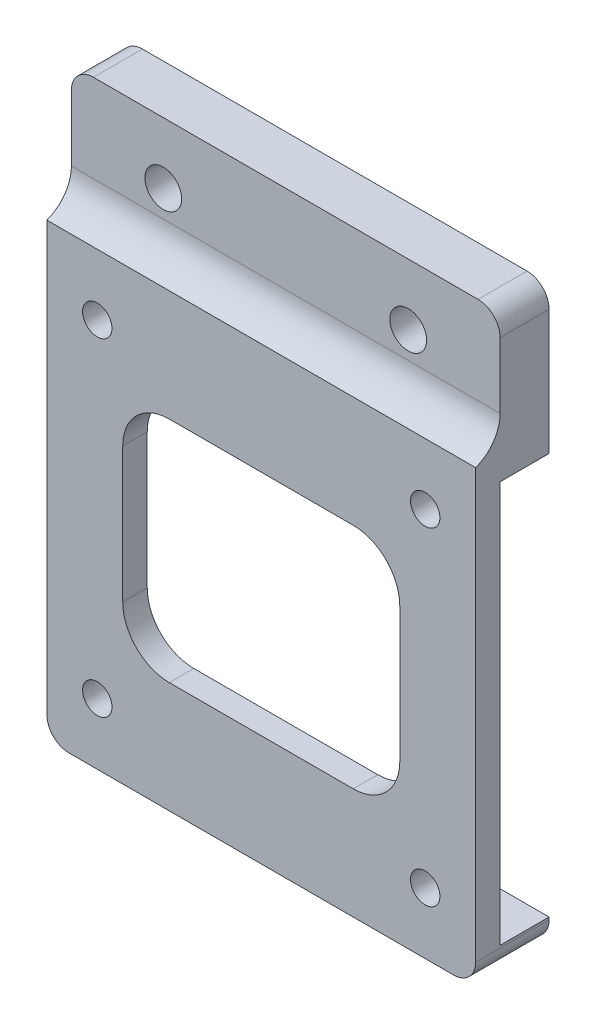
ISO-10303-21;
HEADER;
FILE_DESCRIPTION(('STEP AP214'),'2;1');
FILE_NAME('part.step','',(''),(''),'','','');
FILE_SCHEMA(('AUTOMOTIVE_DESIGN { 1 0 10303 214 1 1 1 1 }'));
ENDSEC;
DATA;
#1=APPLICATION_CONTEXT('core data for automotive mechanical design processes');
#2=APPLICATION_PROTOCOL_DEFINITION('international standard','automotive_design',2000,#1);
#3=PRODUCT_CONTEXT('',#1,'mechanical');
#4=PRODUCT('Part','Part','',(#3));
#5=PRODUCT_RELATED_PRODUCT_CATEGORY('part','',(#4));
#6=PRODUCT_DEFINITION_FORMATION('','',#4);
#7=PRODUCT_DEFINITION_CONTEXT('part definition',#1,'design');
#8=PRODUCT_DEFINITION('design','',#6,#7);
#9=PRODUCT_DEFINITION_SHAPE('','',#8);
#10=(LENGTH_UNIT() NAMED_UNIT(*) SI_UNIT(.MILLI.,.METRE.));
#11=(NAMED_UNIT(*) PLANE_ANGLE_UNIT() SI_UNIT($,.RADIAN.));
#12=(NAMED_UNIT(*) SI_UNIT($,.STERADIAN.) SOLID_ANGLE_UNIT());
#13=UNCERTAINTY_MEASURE_WITH_UNIT(LENGTH_MEASURE(1.E-05),#10,'distance_accuracy_value','');
#14=(GEOMETRIC_REPRESENTATION_CONTEXT(3) GLOBAL_UNCERTAINTY_ASSIGNED_CONTEXT((#13)) GLOBAL_UNIT_ASSIGNED_CONTEXT((#10,
#11,#12)) REPRESENTATION_CONTEXT('',''));
#15=CARTESIAN_POINT('',(0.,0.,0.));
#16=DIRECTION('',(0.,0.,1.));
#17=DIRECTION('',(1.,0.,0.));
#18=AXIS2_PLACEMENT_3D('',#15,#16,#17);
#19=CARTESIAN_POINT('',(0.,0.,0.));
#20=DIRECTION('',(0.,0.,1.));
#21=DIRECTION('',(1.,0.,0.));
#22=AXIS2_PLACEMENT_3D('',#19,#20,#21);
#23=PLANE('',#22);
#24=CARTESIAN_POINT('',(0.,0.,0.));
#25=DIRECTION('',(0.,0.,1.));
#26=DIRECTION('',(1.,0.,0.));
#27=AXIS2_PLACEMENT_3D('',#24,#25,#26);
#28=CIRCLE('',#27,1.905);
#29=CARTESIAN_POINT('',(1.905,0.,0.));
#30=VERTEX_POINT('',#29);
#31=EDGE_CURVE('E280',#30,#30,#28,.T.);
#32=ORIENTED_EDGE('',*,*,#31,.T.);
#33=EDGE_LOOP('',(#32));
#34=FACE_BOUND('',#33,.T.);
#35=CARTESIAN_POINT('',(25.4,0.,0.));
#36=DIRECTION('',(0.,0.,1.));
#37=DIRECTION('',(1.,0.,0.));
#38=AXIS2_PLACEMENT_3D('',#35,#36,#37);
#39=CIRCLE('',#38,1.905);
#40=CARTESIAN_POINT('',(27.305,0.,0.));
#41=VERTEX_POINT('',#40);
#42=EDGE_CURVE('E275',#41,#41,#39,.T.);
#43=ORIENTED_EDGE('',*,*,#42,.T.);
#44=EDGE_LOOP('',(#43));
#45=FACE_BOUND('',#44,.T.);
#46=DIRECTION('',(0.,-1.,0.));
#47=VECTOR('',#46,1.);
#48=CARTESIAN_POINT('',(-9.525,6.35,0.));
#49=LINE('',#48,#47);
#50=CARTESIAN_POINT('',(-9.525,4.064,0.));
#51=VERTEX_POINT('',#50);
#52=CARTESIAN_POINT('',(-9.525,-8.89,0.));
#53=VERTEX_POINT('',#52);
#54=EDGE_CURVE('E304',#51,#53,#49,.T.);
#55=ORIENTED_EDGE('',*,*,#54,.F.);
#56=CARTESIAN_POINT('',(-7.239,4.064,0.));
#57=DIRECTION('',(0.,0.,1.));
#58=DIRECTION('',(1.,0.,0.));
#59=AXIS2_PLACEMENT_3D('',#56,#57,#58);
#60=CIRCLE('',#59,2.286);
#61=CARTESIAN_POINT('',(-7.239,6.35,0.));
#62=VERTEX_POINT('',#61);
#63=EDGE_CURVE('E356',#51,#62,#60,.F.);
#64=ORIENTED_EDGE('',*,*,#63,.T.);
#65=DIRECTION('',(-1.,0.,0.));
#66=VECTOR('',#65,1.);
#67=CARTESIAN_POINT('',(-9.525,6.35,0.));
#68=LINE('',#67,#66);
#69=CARTESIAN_POINT('',(32.639,6.35,0.));
#70=VERTEX_POINT('',#69);
#71=EDGE_CURVE('E296',#70,#62,#68,.T.);
#72=ORIENTED_EDGE('',*,*,#71,.F.);
#73=CARTESIAN_POINT('',(32.639,4.064,0.));
#74=DIRECTION('',(0.,0.,1.));
#75=DIRECTION('',(1.,0.,0.));
#76=AXIS2_PLACEMENT_3D('',#73,#74,#75);
#77=CIRCLE('',#76,2.286);
#78=CARTESIAN_POINT('',(34.925,4.064,0.));
#79=VERTEX_POINT('',#78);
#80=EDGE_CURVE('E353',#70,#79,#77,.F.);
#81=ORIENTED_EDGE('',*,*,#80,.T.);
#82=DIRECTION('',(0.,1.,0.));
#83=VECTOR('',#82,1.);
#84=CARTESIAN_POINT('',(34.925,6.35,0.));
#85=LINE('',#84,#83);
#86=CARTESIAN_POINT('',(34.925,-8.89,0.));
#87=VERTEX_POINT('',#86);
#88=EDGE_CURVE('E311',#87,#79,#85,.T.);
#89=ORIENTED_EDGE('',*,*,#88,.F.);
#90=DIRECTION('',(-1.,0.,0.));
#91=VECTOR('',#90,1.);
#92=CARTESIAN_POINT('',(34.925,-8.89,0.));
#93=LINE('',#92,#91);
#94=EDGE_CURVE('E214',#87,#53,#93,.T.);
#95=ORIENTED_EDGE('',*,*,#94,.T.);
#96=EDGE_LOOP('',(#55,#64,#72,#81,#89,#95));
#97=FACE_BOUND('',#96,.T.);
#98=ADVANCED_FACE('F43',(#34,#45,#97),#23,.F.);
#99=CARTESIAN_POINT('',(-9.525,6.35,5.08));
#100=DIRECTION('',(1.,0.,0.));
#101=DIRECTION('',(0.,1.,0.));
#102=AXIS2_PLACEMENT_3D('',#99,#100,#101);
#103=PLANE('',#102);
#104=CARTESIAN_POINT('',(-9.525,-50.51,0.));
#105=VERTEX_POINT('',#104);
#106=CARTESIAN_POINT('',(-9.52499999999999,-50.764,0.));
#107=VERTEX_POINT('',#106);
#108=EDGE_CURVE('E288',#105,#107,#49,.T.);
#109=ORIENTED_EDGE('',*,*,#108,.T.);
#110=DIRECTION('',(0.,0.,-1.));
#111=VECTOR('',#110,1.);
#112=CARTESIAN_POINT('',(-9.52499999999999,-50.764,5.08));
#113=LINE('',#112,#111);
#114=CARTESIAN_POINT('',(-9.52499999999999,-50.764,7.62));
#115=VERTEX_POINT('',#114);
#116=EDGE_CURVE('E350',#107,#115,#113,.F.);
#117=ORIENTED_EDGE('',*,*,#116,.T.);
#118=DIRECTION('',(0.,-1.,0.));
#119=VECTOR('',#118,1.);
#120=CARTESIAN_POINT('',(-9.52499999999999,-53.05,7.62));
#121=LINE('',#120,#119);
#122=CARTESIAN_POINT('',(-9.52499999999999,-6.35,7.62));
#123=VERTEX_POINT('',#122);
#124=EDGE_CURVE('E259',#123,#115,#121,.T.);
#125=ORIENTED_EDGE('',*,*,#124,.F.);
#126=CARTESIAN_POINT('',(-9.525,-2.75789755157234,8.89));
#127=DIRECTION('',(1.,0.,0.));
#128=DIRECTION('',(0.,1.,0.));
#129=AXIS2_PLACEMENT_3D('',#126,#127,#128);
#130=CIRCLE('',#129,3.81);
#131=CARTESIAN_POINT('',(-9.525,-2.75789755157234,5.08));
#132=VERTEX_POINT('',#131);
#133=EDGE_CURVE('E52',#123,#132,#130,.T.);
#134=ORIENTED_EDGE('',*,*,#133,.T.);
#135=DIRECTION('',(0.,-1.,0.));
#136=VECTOR('',#135,1.);
#137=CARTESIAN_POINT('',(-9.525,6.35,5.08));
#138=LINE('',#137,#136);
#139=CARTESIAN_POINT('',(-9.525,4.064,5.08));
#140=VERTEX_POINT('',#139);
#141=EDGE_CURVE('E292',#140,#132,#138,.T.);
#142=ORIENTED_EDGE('',*,*,#141,.F.);
#143=DIRECTION('',(0.,0.,-1.));
#144=VECTOR('',#143,1.);
#145=CARTESIAN_POINT('',(-9.525,4.064,5.08));
#146=LINE('',#145,#144);
#147=EDGE_CURVE('E346',#140,#51,#146,.T.);
#148=ORIENTED_EDGE('',*,*,#147,.T.);
#149=ORIENTED_EDGE('',*,*,#54,.T.);
#150=DIRECTION('',(0.,0.,-1.));
#151=VECTOR('',#150,1.);
#152=CARTESIAN_POINT('',(-9.525,-8.89,5.08));
#153=LINE('',#152,#151);
#154=CARTESIAN_POINT('',(-9.525,-8.89,5.08));
#155=VERTEX_POINT('',#154);
#156=EDGE_CURVE('E225',#155,#53,#153,.T.);
#157=ORIENTED_EDGE('',*,*,#156,.F.);
#158=DIRECTION('',(0.,-1.,0.));
#159=VECTOR('',#158,1.);
#160=CARTESIAN_POINT('',(-9.525,-8.89,5.08));
#161=LINE('',#160,#159);
#162=CARTESIAN_POINT('',(-9.525,-50.51,5.08));
#163=VERTEX_POINT('',#162);
#164=EDGE_CURVE('E204',#155,#163,#161,.T.);
#165=ORIENTED_EDGE('',*,*,#164,.T.);
#166=DIRECTION('',(0.,0.,-1.));
#167=VECTOR('',#166,1.);
#168=CARTESIAN_POINT('',(-9.525,-50.51,5.08));
#169=LINE('',#168,#167);
#170=EDGE_CURVE('E199',#163,#105,#169,.T.);
#171=ORIENTED_EDGE('',*,*,#170,.T.);
#172=EDGE_LOOP('',(#109,#117,#125,#134,#142,#148,#149,#157,#165,#171));
#173=FACE_BOUND('',#172,.T.);
#174=ADVANCED_FACE('F563',(#173),#103,.F.);
#175=CARTESIAN_POINT('',(34.925,6.35,5.08));
#176=DIRECTION('',(-1.,0.,0.));
#177=DIRECTION('',(0.,-1.,0.));
#178=AXIS2_PLACEMENT_3D('',#175,#176,#177);
#179=PLANE('',#178);
#180=DIRECTION('',(0.,1.,0.));
#181=VECTOR('',#180,1.);
#182=CARTESIAN_POINT('',(34.925,-53.05,7.62));
#183=LINE('',#182,#181);
#184=CARTESIAN_POINT('',(34.925,-50.764,7.62));
#185=VERTEX_POINT('',#184);
#186=CARTESIAN_POINT('',(34.925,-6.35,7.62));
#187=VERTEX_POINT('',#186);
#188=EDGE_CURVE('E267',#185,#187,#183,.T.);
#189=ORIENTED_EDGE('',*,*,#188,.F.);
#190=DIRECTION('',(0.,0.,-1.));
#191=VECTOR('',#190,1.);
#192=CARTESIAN_POINT('',(34.925,-50.764,5.08));
#193=LINE('',#192,#191);
#194=CARTESIAN_POINT('',(34.925,-50.764,0.));
#195=VERTEX_POINT('',#194);
#196=EDGE_CURVE('E324',#185,#195,#193,.T.);
#197=ORIENTED_EDGE('',*,*,#196,.T.);
#198=CARTESIAN_POINT('',(34.925,-50.51,0.));
#199=VERTEX_POINT('',#198);
#200=EDGE_CURVE('E220',#195,#199,#85,.T.);
#201=ORIENTED_EDGE('',*,*,#200,.T.);
#202=DIRECTION('',(0.,0.,-1.));
#203=VECTOR('',#202,1.);
#204=CARTESIAN_POINT('',(34.925,-50.51,5.08));
#205=LINE('',#204,#203);
#206=CARTESIAN_POINT('',(34.925,-50.51,5.08));
#207=VERTEX_POINT('',#206);
#208=EDGE_CURVE('E196',#207,#199,#205,.T.);
#209=ORIENTED_EDGE('',*,*,#208,.F.);
#210=DIRECTION('',(0.,-1.,0.));
#211=VECTOR('',#210,1.);
#212=CARTESIAN_POINT('',(34.925,-8.89,5.08));
#213=LINE('',#212,#211);
#214=CARTESIAN_POINT('',(34.925,-8.89,5.08));
#215=VERTEX_POINT('',#214);
#216=EDGE_CURVE('E205',#215,#207,#213,.T.);
#217=ORIENTED_EDGE('',*,*,#216,.F.);
#218=DIRECTION('',(0.,0.,-1.));
#219=VECTOR('',#218,1.);
#220=CARTESIAN_POINT('',(34.925,-8.89,5.08));
#221=LINE('',#220,#219);
#222=EDGE_CURVE('E320',#215,#87,#221,.T.);
#223=ORIENTED_EDGE('',*,*,#222,.T.);
#224=ORIENTED_EDGE('',*,*,#88,.T.);
#225=DIRECTION('',(0.,0.,-1.));
#226=VECTOR('',#225,1.);
#227=CARTESIAN_POINT('',(34.925,4.064,5.08));
#228=LINE('',#227,#226);
#229=CARTESIAN_POINT('',(34.925,4.064,5.08));
#230=VERTEX_POINT('',#229);
#231=EDGE_CURVE('E303',#79,#230,#228,.F.);
#232=ORIENTED_EDGE('',*,*,#231,.T.);
#233=DIRECTION('',(0.,1.,0.));
#234=VECTOR('',#233,1.);
#235=CARTESIAN_POINT('',(34.925,6.35,5.08));
#236=LINE('',#235,#234);
#237=CARTESIAN_POINT('',(34.925,-2.75789755157234,5.08));
#238=VERTEX_POINT('',#237);
#239=EDGE_CURVE('E295',#238,#230,#236,.T.);
#240=ORIENTED_EDGE('',*,*,#239,.F.);
#241=CARTESIAN_POINT('',(34.925,-2.75789755157234,8.89));
#242=DIRECTION('',(-1.,0.,0.));
#243=DIRECTION('',(0.,-1.,0.));
#244=AXIS2_PLACEMENT_3D('',#241,#242,#243);
#245=CIRCLE('',#244,3.81);
#246=EDGE_CURVE('E11',#238,#187,#245,.T.);
#247=ORIENTED_EDGE('',*,*,#246,.T.);
#248=EDGE_LOOP('',(#189,#197,#201,#209,#217,#223,#224,#232,#240,#247));
#249=FACE_BOUND('',#248,.T.);
#250=ADVANCED_FACE('F217',(#249),#179,.F.);
#251=CARTESIAN_POINT('',(-4.3,-12.7,5.08));
#252=DIRECTION('',(0.,0.,-1.));
#253=DIRECTION('',(-1.,0.,0.));
#254=AXIS2_PLACEMENT_3D('',#251,#252,#253);
#255=CYLINDRICAL_SURFACE('',#254,1.524);
#256=CARTESIAN_POINT('',(-4.3,-12.7,7.62));
#257=DIRECTION('',(0.,0.,1.));
#258=DIRECTION('',(1.,0.,0.));
#259=AXIS2_PLACEMENT_3D('',#256,#257,#258);
#260=CIRCLE('',#259,1.524);
#261=CARTESIAN_POINT('',(-2.776,-12.7,7.62));
#262=VERTEX_POINT('',#261);
#263=EDGE_CURVE('E243',#262,#262,#260,.T.);
#264=ORIENTED_EDGE('',*,*,#263,.T.);
#265=EDGE_LOOP('',(#264));
#266=FACE_BOUND('',#265,.T.);
#267=CARTESIAN_POINT('',(-4.3,-12.7,5.08));
#268=DIRECTION('',(0.,0.,-1.));
#269=DIRECTION('',(-1.,0.,0.));
#270=AXIS2_PLACEMENT_3D('',#267,#268,#269);
#271=CIRCLE('',#270,1.524);
#272=CARTESIAN_POINT('',(-5.824,-12.7,5.08));
#273=VERTEX_POINT('',#272);
#274=EDGE_CURVE('E239',#273,#273,#271,.T.);
#275=ORIENTED_EDGE('',*,*,#274,.T.);
#276=EDGE_LOOP('',(#275));
#277=FACE_BOUND('',#276,.T.);
#278=ADVANCED_FACE('F532',(#266,#277),#255,.F.);
#279=CARTESIAN_POINT('',(29.7,-12.7,5.08));
#280=DIRECTION('',(0.,0.,-1.));
#281=DIRECTION('',(-1.,0.,0.));
#282=AXIS2_PLACEMENT_3D('',#279,#280,#281);
#283=CYLINDRICAL_SURFACE('',#282,1.524);
#284=CARTESIAN_POINT('',(29.7,-12.7,7.62));
#285=DIRECTION('',(0.,0.,1.));
#286=DIRECTION('',(1.,0.,0.));
#287=AXIS2_PLACEMENT_3D('',#284,#285,#286);
#288=CIRCLE('',#287,1.524);
#289=CARTESIAN_POINT('',(31.224,-12.7,7.62));
#290=VERTEX_POINT('',#289);
#291=EDGE_CURVE('E251',#290,#290,#288,.T.);
#292=ORIENTED_EDGE('',*,*,#291,.T.);
#293=EDGE_LOOP('',(#292));
#294=FACE_BOUND('',#293,.T.);
#295=CARTESIAN_POINT('',(29.7,-12.7,5.08));
#296=DIRECTION('',(0.,0.,-1.));
#297=DIRECTION('',(-1.,0.,0.));
#298=AXIS2_PLACEMENT_3D('',#295,#296,#297);
#299=CIRCLE('',#298,1.524);
#300=CARTESIAN_POINT('',(28.176,-12.7,5.08));
#301=VERTEX_POINT('',#300);
#302=EDGE_CURVE('E234',#301,#301,#299,.T.);
#303=ORIENTED_EDGE('',*,*,#302,.T.);
#304=EDGE_LOOP('',(#303));
#305=FACE_BOUND('',#304,.T.);
#306=ADVANCED_FACE('F535',(#294,#305),#283,.F.);
#307=CARTESIAN_POINT('',(29.7,-46.7,5.08));
#308=DIRECTION('',(0.,0.,-1.));
#309=DIRECTION('',(-1.,0.,0.));
#310=AXIS2_PLACEMENT_3D('',#307,#308,#309);
#311=CYLINDRICAL_SURFACE('',#310,1.524);
#312=CARTESIAN_POINT('',(29.7,-46.7,7.62));
#313=DIRECTION('',(0.,0.,1.));
#314=DIRECTION('',(1.,0.,0.));
#315=AXIS2_PLACEMENT_3D('',#312,#313,#314);
#316=CIRCLE('',#315,1.524);
#317=CARTESIAN_POINT('',(31.224,-46.7,7.62));
#318=VERTEX_POINT('',#317);
#319=EDGE_CURVE('E247',#318,#318,#316,.T.);
#320=ORIENTED_EDGE('',*,*,#319,.T.);
#321=EDGE_LOOP('',(#320));
#322=FACE_BOUND('',#321,.T.);
#323=CARTESIAN_POINT('',(29.7,-46.7,5.08));
#324=DIRECTION('',(0.,0.,-1.));
#325=DIRECTION('',(-1.,0.,0.));
#326=AXIS2_PLACEMENT_3D('',#323,#324,#325);
#327=CIRCLE('',#326,1.524);
#328=CARTESIAN_POINT('',(28.176,-46.7,5.08));
#329=VERTEX_POINT('',#328);
#330=EDGE_CURVE('E230',#329,#329,#327,.T.);
#331=ORIENTED_EDGE('',*,*,#330,.T.);
#332=EDGE_LOOP('',(#331));
#333=FACE_BOUND('',#332,.T.);
#334=ADVANCED_FACE('F551',(#322,#333),#311,.F.);
#335=CARTESIAN_POINT('',(-4.3,-46.7,5.08));
#336=DIRECTION('',(0.,0.,-1.));
#337=DIRECTION('',(-1.,0.,0.));
#338=AXIS2_PLACEMENT_3D('',#335,#336,#337);
#339=CYLINDRICAL_SURFACE('',#338,1.524);
#340=CARTESIAN_POINT('',(-4.3,-46.7,7.62));
#341=DIRECTION('',(0.,0.,1.));
#342=DIRECTION('',(1.,0.,0.));
#343=AXIS2_PLACEMENT_3D('',#340,#341,#342);
#344=CIRCLE('',#343,1.524);
#345=CARTESIAN_POINT('',(-2.776,-46.7,7.62));
#346=VERTEX_POINT('',#345);
#347=EDGE_CURVE('E255',#346,#346,#344,.T.);
#348=ORIENTED_EDGE('',*,*,#347,.T.);
#349=EDGE_LOOP('',(#348));
#350=FACE_BOUND('',#349,.T.);
#351=CARTESIAN_POINT('',(-4.3,-46.7,5.08));
#352=DIRECTION('',(0.,0.,-1.));
#353=DIRECTION('',(-1.,0.,0.));
#354=AXIS2_PLACEMENT_3D('',#351,#352,#353);
#355=CIRCLE('',#354,1.524);
#356=CARTESIAN_POINT('',(-5.824,-46.7,5.08));
#357=VERTEX_POINT('',#356);
#358=EDGE_CURVE('E235',#357,#357,#355,.T.);
#359=ORIENTED_EDGE('',*,*,#358,.T.);
#360=EDGE_LOOP('',(#359));
#361=FACE_BOUND('',#360,.T.);
#362=ADVANCED_FACE('F548',(#350,#361),#339,.F.);
#363=CARTESIAN_POINT('',(0.,0.,5.08));
#364=DIRECTION('',(0.,0.,1.));
#365=DIRECTION('',(1.,0.,0.));
#366=AXIS2_PLACEMENT_3D('',#363,#364,#365);
#367=PLANE('',#366);
#368=ORIENTED_EDGE('',*,*,#141,.T.);
#369=DIRECTION('',(-1.,0.,0.));
#370=VECTOR('',#369,1.);
#371=CARTESIAN_POINT('',(34.925,-2.75789755157234,5.08));
#372=LINE('',#371,#370);
#373=EDGE_CURVE('E59',#132,#238,#372,.F.);
#374=ORIENTED_EDGE('',*,*,#373,.T.);
#375=ORIENTED_EDGE('',*,*,#239,.T.);
#376=CARTESIAN_POINT('',(32.639,4.064,5.08));
#377=DIRECTION('',(0.,0.,1.));
#378=DIRECTION('',(1.,0.,0.));
#379=AXIS2_PLACEMENT_3D('',#376,#377,#378);
#380=CIRCLE('',#379,2.286);
#381=CARTESIAN_POINT('',(32.639,6.35,5.08));
#382=VERTEX_POINT('',#381);
#383=EDGE_CURVE('E366',#230,#382,#380,.T.);
#384=ORIENTED_EDGE('',*,*,#383,.T.);
#385=DIRECTION('',(-1.,0.,0.));
#386=VECTOR('',#385,1.);
#387=CARTESIAN_POINT('',(-9.525,6.35,5.08));
#388=LINE('',#387,#386);
#389=CARTESIAN_POINT('',(-7.239,6.35,5.08));
#390=VERTEX_POINT('',#389);
#391=EDGE_CURVE('E299',#382,#390,#388,.T.);
#392=ORIENTED_EDGE('',*,*,#391,.T.);
#393=CARTESIAN_POINT('',(-7.239,4.064,5.08));
#394=DIRECTION('',(0.,0.,1.));
#395=DIRECTION('',(1.,0.,0.));
#396=AXIS2_PLACEMENT_3D('',#393,#394,#395);
#397=CIRCLE('',#396,2.286);
#398=EDGE_CURVE('E369',#390,#140,#397,.T.);
#399=ORIENTED_EDGE('',*,*,#398,.T.);
#400=EDGE_LOOP('',(#368,#374,#375,#384,#392,#399));
#401=FACE_BOUND('',#400,.T.);
#402=CARTESIAN_POINT('',(0.,0.,5.08));
#403=DIRECTION('',(0.,0.,1.));
#404=DIRECTION('',(1.,0.,0.));
#405=AXIS2_PLACEMENT_3D('',#402,#403,#404);
#406=CIRCLE('',#405,1.905);
#407=CARTESIAN_POINT('',(1.905,0.,5.08));
#408=VERTEX_POINT('',#407);
#409=EDGE_CURVE('E284',#408,#408,#406,.T.);
#410=ORIENTED_EDGE('',*,*,#409,.F.);
#411=EDGE_LOOP('',(#410));
#412=FACE_BOUND('',#411,.T.);
#413=CARTESIAN_POINT('',(25.4,0.,5.08));
#414=DIRECTION('',(0.,0.,1.));
#415=DIRECTION('',(1.,0.,0.));
#416=AXIS2_PLACEMENT_3D('',#413,#414,#415);
#417=CIRCLE('',#416,1.905);
#418=CARTESIAN_POINT('',(27.305,0.,5.08));
#419=VERTEX_POINT('',#418);
#420=EDGE_CURVE('E276',#419,#419,#417,.T.);
#421=ORIENTED_EDGE('',*,*,#420,.F.);
#422=EDGE_LOOP('',(#421));
#423=FACE_BOUND('',#422,.T.);
#424=ADVANCED_FACE('F550',(#401,#412,#423),#367,.T.);
#425=ORIENTED_EDGE('',*,*,#200,.F.);
#426=CARTESIAN_POINT('',(32.639,-50.764,0.));
#427=DIRECTION('',(0.,0.,1.));
#428=DIRECTION('',(1.,0.,0.));
#429=AXIS2_PLACEMENT_3D('',#426,#427,#428);
#430=CIRCLE('',#429,2.286);
#431=CARTESIAN_POINT('',(32.639,-53.05,0.));
#432=VERTEX_POINT('',#431);
#433=EDGE_CURVE('E330',#195,#432,#430,.F.);
#434=ORIENTED_EDGE('',*,*,#433,.T.);
#435=DIRECTION('',(1.,0.,0.));
#436=VECTOR('',#435,1.);
#437=CARTESIAN_POINT('',(-9.52499999999999,-53.05,0.));
#438=LINE('',#437,#436);
#439=CARTESIAN_POINT('',(-7.23899999999999,-53.05,0.));
#440=VERTEX_POINT('',#439);
#441=EDGE_CURVE('E307',#440,#432,#438,.T.);
#442=ORIENTED_EDGE('',*,*,#441,.F.);
#443=CARTESIAN_POINT('',(-7.23899999999999,-50.764,0.));
#444=DIRECTION('',(0.,0.,1.));
#445=DIRECTION('',(1.,0.,0.));
#446=AXIS2_PLACEMENT_3D('',#443,#444,#445);
#447=CIRCLE('',#446,2.286);
#448=EDGE_CURVE('E327',#440,#107,#447,.F.);
#449=ORIENTED_EDGE('',*,*,#448,.T.);
#450=ORIENTED_EDGE('',*,*,#108,.F.);
#451=DIRECTION('',(-1.,0.,0.));
#452=VECTOR('',#451,1.);
#453=CARTESIAN_POINT('',(34.925,-50.51,0.));
#454=LINE('',#453,#452);
#455=EDGE_CURVE('E456',#199,#105,#454,.T.);
#456=ORIENTED_EDGE('',*,*,#455,.F.);
#457=EDGE_LOOP('',(#425,#434,#442,#449,#450,#456));
#458=FACE_BOUND('',#457,.T.);
#459=ADVANCED_FACE('F558',(#458),#23,.F.);
#460=CARTESIAN_POINT('',(-9.52499999999999,-53.05,5.08));
#461=DIRECTION('',(0.,1.,0.));
#462=DIRECTION('',(0.,0.,1.));
#463=AXIS2_PLACEMENT_3D('',#460,#461,#462);
#464=PLANE('',#463);
#465=ORIENTED_EDGE('',*,*,#441,.T.);
#466=DIRECTION('',(0.,0.,-1.));
#467=VECTOR('',#466,1.);
#468=CARTESIAN_POINT('',(32.639,-53.05,5.08));
#469=LINE('',#468,#467);
#470=CARTESIAN_POINT('',(32.639,-53.05,7.62));
#471=VERTEX_POINT('',#470);
#472=EDGE_CURVE('E337',#432,#471,#469,.F.);
#473=ORIENTED_EDGE('',*,*,#472,.T.);
#474=DIRECTION('',(1.,0.,0.));
#475=VECTOR('',#474,1.);
#476=CARTESIAN_POINT('',(-9.52499999999999,-53.05,7.62));
#477=LINE('',#476,#475);
#478=CARTESIAN_POINT('',(-7.23899999999999,-53.05,7.62));
#479=VERTEX_POINT('',#478);
#480=EDGE_CURVE('E263',#479,#471,#477,.T.);
#481=ORIENTED_EDGE('',*,*,#480,.F.);
#482=DIRECTION('',(0.,0.,-1.));
#483=VECTOR('',#482,1.);
#484=CARTESIAN_POINT('',(-7.23899999999999,-53.05,5.08));
#485=LINE('',#484,#483);
#486=EDGE_CURVE('E333',#479,#440,#485,.T.);
#487=ORIENTED_EDGE('',*,*,#486,.T.);
#488=EDGE_LOOP('',(#465,#473,#481,#487));
#489=FACE_BOUND('',#488,.T.);
#490=ADVANCED_FACE('F573',(#489),#464,.F.);
#491=CARTESIAN_POINT('',(-9.525,6.35,5.08));
#492=DIRECTION('',(0.,-1.,0.));
#493=DIRECTION('',(0.,0.,-1.));
#494=AXIS2_PLACEMENT_3D('',#491,#492,#493);
#495=PLANE('',#494);
#496=ORIENTED_EDGE('',*,*,#71,.T.);
#497=DIRECTION('',(0.,0.,-1.));
#498=VECTOR('',#497,1.);
#499=CARTESIAN_POINT('',(-7.239,6.35,5.08));
#500=LINE('',#499,#498);
#501=EDGE_CURVE('E363',#62,#390,#500,.F.);
#502=ORIENTED_EDGE('',*,*,#501,.T.);
#503=ORIENTED_EDGE('',*,*,#391,.F.);
#504=DIRECTION('',(0.,0.,-1.));
#505=VECTOR('',#504,1.);
#506=CARTESIAN_POINT('',(32.639,6.35,5.08));
#507=LINE('',#506,#505);
#508=EDGE_CURVE('E359',#382,#70,#507,.T.);
#509=ORIENTED_EDGE('',*,*,#508,.T.);
#510=EDGE_LOOP('',(#496,#502,#503,#509));
#511=FACE_BOUND('',#510,.T.);
#512=ADVANCED_FACE('F578',(#511),#495,.F.);
#513=CARTESIAN_POINT('',(0.,0.,5.08));
#514=DIRECTION('',(0.,0.,-1.));
#515=DIRECTION('',(-1.,0.,0.));
#516=AXIS2_PLACEMENT_3D('',#513,#514,#515);
#517=CYLINDRICAL_SURFACE('',#516,1.905);
#518=ORIENTED_EDGE('',*,*,#409,.T.);
#519=EDGE_LOOP('',(#518));
#520=FACE_BOUND('',#519,.T.);
#521=ORIENTED_EDGE('',*,*,#31,.F.);
#522=EDGE_LOOP('',(#521));
#523=FACE_BOUND('',#522,.T.);
#524=ADVANCED_FACE('F775',(#520,#523),#517,.F.);
#525=CARTESIAN_POINT('',(25.4,0.,5.08));
#526=DIRECTION('',(0.,0.,-1.));
#527=DIRECTION('',(-1.,0.,0.));
#528=AXIS2_PLACEMENT_3D('',#525,#526,#527);
#529=CYLINDRICAL_SURFACE('',#528,1.905);
#530=ORIENTED_EDGE('',*,*,#420,.T.);
#531=EDGE_LOOP('',(#530));
#532=FACE_BOUND('',#531,.T.);
#533=ORIENTED_EDGE('',*,*,#42,.F.);
#534=EDGE_LOOP('',(#533));
#535=FACE_BOUND('',#534,.T.);
#536=ADVANCED_FACE('F519',(#532,#535),#529,.F.);
#537=CARTESIAN_POINT('',(0.,0.,7.62));
#538=DIRECTION('',(0.,0.,-1.));
#539=DIRECTION('',(-1.,0.,0.));
#540=AXIS2_PLACEMENT_3D('',#537,#538,#539);
#541=PLANE('',#540);
#542=DIRECTION('',(1.,0.,0.));
#543=VECTOR('',#542,1.);
#544=CARTESIAN_POINT('',(-1.66203160509487,-41.5319327731093,7.62));
#545=LINE('',#544,#543);
#546=CARTESIAN_POINT('',(3.16396839490513,-41.5319327731093,7.62));
#547=VERTEX_POINT('',#546);
#548=CARTESIAN_POINT('',(22.2360316050949,-41.5319327731093,7.62));
#549=VERTEX_POINT('',#548);
#550=EDGE_CURVE('E469',#547,#549,#545,.T.);
#551=ORIENTED_EDGE('',*,*,#550,.F.);
#552=CARTESIAN_POINT('',(3.16396839490513,-36.7059327731093,7.62));
#553=DIRECTION('',(0.,0.,-1.));
#554=DIRECTION('',(-1.,0.,0.));
#555=AXIS2_PLACEMENT_3D('',#552,#553,#554);
#556=CIRCLE('',#555,4.826);
#557=CARTESIAN_POINT('',(-1.66203160509487,-36.7059327731093,7.62));
#558=VERTEX_POINT('',#557);
#559=EDGE_CURVE('E422',#547,#558,#556,.T.);
#560=ORIENTED_EDGE('',*,*,#559,.T.);
#561=DIRECTION('',(0.,-1.,0.));
#562=VECTOR('',#561,1.);
#563=CARTESIAN_POINT('',(-1.66203160509487,-17.8680672268908,7.62));
#564=LINE('',#563,#562);
#565=CARTESIAN_POINT('',(-1.66203160509487,-22.6940672268908,7.62));
#566=VERTEX_POINT('',#565);
#567=EDGE_CURVE('E473',#566,#558,#564,.T.);
#568=ORIENTED_EDGE('',*,*,#567,.F.);
#569=CARTESIAN_POINT('',(3.16396839490513,-22.6940672268908,7.62));
#570=DIRECTION('',(0.,0.,-1.));
#571=DIRECTION('',(-1.,0.,0.));
#572=AXIS2_PLACEMENT_3D('',#569,#570,#571);
#573=CIRCLE('',#572,4.826);
#574=CARTESIAN_POINT('',(3.16396839490513,-17.8680672268908,7.62));
#575=VERTEX_POINT('',#574);
#576=EDGE_CURVE('E434',#566,#575,#573,.T.);
#577=ORIENTED_EDGE('',*,*,#576,.T.);
#578=DIRECTION('',(1.,0.,0.));
#579=VECTOR('',#578,1.);
#580=CARTESIAN_POINT('',(-1.66203160509487,-17.8680672268908,7.62));
#581=LINE('',#580,#579);
#582=CARTESIAN_POINT('',(22.2360316050949,-17.8680672268908,7.62));
#583=VERTEX_POINT('',#582);
#584=EDGE_CURVE('E458',#575,#583,#581,.T.);
#585=ORIENTED_EDGE('',*,*,#584,.T.);
#586=CARTESIAN_POINT('',(22.2360316050949,-22.6940672268908,7.62));
#587=DIRECTION('',(0.,0.,-1.));
#588=DIRECTION('',(-1.,0.,0.));
#589=AXIS2_PLACEMENT_3D('',#586,#587,#588);
#590=CIRCLE('',#589,4.826);
#591=CARTESIAN_POINT('',(27.0620316050949,-22.6940672268908,7.62));
#592=VERTEX_POINT('',#591);
#593=EDGE_CURVE('E428',#583,#592,#590,.T.);
#594=ORIENTED_EDGE('',*,*,#593,.T.);
#595=DIRECTION('',(0.,-1.,0.));
#596=VECTOR('',#595,1.);
#597=CARTESIAN_POINT('',(27.0620316050949,-17.8680672268908,7.62));
#598=LINE('',#597,#596);
#599=CARTESIAN_POINT('',(27.0620316050949,-36.7059327731093,7.62));
#600=VERTEX_POINT('',#599);
#601=EDGE_CURVE('E465',#592,#600,#598,.T.);
#602=ORIENTED_EDGE('',*,*,#601,.T.);
#603=CARTESIAN_POINT('',(22.2360316050949,-36.7059327731093,7.62));
#604=DIRECTION('',(0.,0.,-1.));
#605=DIRECTION('',(-1.,0.,0.));
#606=AXIS2_PLACEMENT_3D('',#603,#604,#605);
#607=CIRCLE('',#606,4.826);
#608=EDGE_CURVE('E416',#600,#549,#607,.T.);
#609=ORIENTED_EDGE('',*,*,#608,.T.);
#610=EDGE_LOOP('',(#551,#560,#568,#577,#585,#594,#602,#609));
#611=FACE_BOUND('',#610,.T.);
#612=ORIENTED_EDGE('',*,*,#480,.T.);
#613=CARTESIAN_POINT('',(32.639,-50.764,7.62));
#614=DIRECTION('',(0.,0.,-1.));
#615=DIRECTION('',(-1.,0.,0.));
#616=AXIS2_PLACEMENT_3D('',#613,#614,#615);
#617=CIRCLE('',#616,2.286);
#618=EDGE_CURVE('E343',#471,#185,#617,.F.);
#619=ORIENTED_EDGE('',*,*,#618,.T.);
#620=ORIENTED_EDGE('',*,*,#188,.T.);
#621=DIRECTION('',(-1.,0.,0.));
#622=VECTOR('',#621,1.);
#623=CARTESIAN_POINT('',(-9.52499999999999,-6.35,7.62));
#624=LINE('',#623,#622);
#625=EDGE_CURVE('E271',#187,#123,#624,.T.);
#626=ORIENTED_EDGE('',*,*,#625,.T.);
#627=ORIENTED_EDGE('',*,*,#124,.T.);
#628=CARTESIAN_POINT('',(-7.23899999999999,-50.764,7.62));
#629=DIRECTION('',(0.,0.,-1.));
#630=DIRECTION('',(-1.,0.,0.));
#631=AXIS2_PLACEMENT_3D('',#628,#629,#630);
#632=CIRCLE('',#631,2.286);
#633=EDGE_CURVE('E340',#115,#479,#632,.F.);
#634=ORIENTED_EDGE('',*,*,#633,.T.);
#635=EDGE_LOOP('',(#612,#619,#620,#626,#627,#634));
#636=FACE_BOUND('',#635,.T.);
#637=ORIENTED_EDGE('',*,*,#347,.F.);
#638=EDGE_LOOP('',(#637));
#639=FACE_BOUND('',#638,.T.);
#640=ORIENTED_EDGE('',*,*,#291,.F.);
#641=EDGE_LOOP('',(#640));
#642=FACE_BOUND('',#641,.T.);
#643=ORIENTED_EDGE('',*,*,#319,.F.);
#644=EDGE_LOOP('',(#643));
#645=FACE_BOUND('',#644,.T.);
#646=ORIENTED_EDGE('',*,*,#263,.F.);
#647=EDGE_LOOP('',(#646));
#648=FACE_BOUND('',#647,.T.);
#649=ADVANCED_FACE('F515',(#611,#636,#639,#642,#645,#648),#541,.F.);
#650=CARTESIAN_POINT('',(34.925,-8.89,5.08));
#651=DIRECTION('',(0.,-1.,0.));
#652=DIRECTION('',(1.,0.,0.));
#653=AXIS2_PLACEMENT_3D('',#650,#651,#652);
#654=PLANE('',#653);
#655=ORIENTED_EDGE('',*,*,#94,.F.);
#656=ORIENTED_EDGE('',*,*,#222,.F.);
#657=DIRECTION('',(-1.,0.,0.));
#658=VECTOR('',#657,1.);
#659=CARTESIAN_POINT('',(34.925,-8.89,5.08));
#660=LINE('',#659,#658);
#661=EDGE_CURVE('E209',#215,#155,#660,.T.);
#662=ORIENTED_EDGE('',*,*,#661,.T.);
#663=ORIENTED_EDGE('',*,*,#156,.T.);
#664=EDGE_LOOP('',(#655,#656,#662,#663));
#665=FACE_BOUND('',#664,.T.);
#666=ADVANCED_FACE('F518',(#665),#654,.T.);
#667=CARTESIAN_POINT('',(34.925,-50.51,5.08));
#668=DIRECTION('',(0.,-1.,0.));
#669=DIRECTION('',(0.,0.,-1.));
#670=AXIS2_PLACEMENT_3D('',#667,#668,#669);
#671=PLANE('',#670);
#672=ORIENTED_EDGE('',*,*,#455,.T.);
#673=ORIENTED_EDGE('',*,*,#170,.F.);
#674=DIRECTION('',(-1.,0.,0.));
#675=VECTOR('',#674,1.);
#676=CARTESIAN_POINT('',(34.925,-50.51,5.08));
#677=LINE('',#676,#675);
#678=EDGE_CURVE('E192',#207,#163,#677,.T.);
#679=ORIENTED_EDGE('',*,*,#678,.F.);
#680=ORIENTED_EDGE('',*,*,#208,.T.);
#681=EDGE_LOOP('',(#672,#673,#679,#680));
#682=FACE_BOUND('',#681,.T.);
#683=ADVANCED_FACE('F194',(#682),#671,.F.);
#684=CARTESIAN_POINT('',(0.,0.,5.08));
#685=DIRECTION('',(0.,0.,-1.));
#686=DIRECTION('',(-1.,0.,0.));
#687=AXIS2_PLACEMENT_3D('',#684,#685,#686);
#688=PLANE('',#687);
#689=DIRECTION('',(0.,1.,0.));
#690=VECTOR('',#689,1.);
#691=CARTESIAN_POINT('',(-1.66203160509487,0.,5.08));
#692=LINE('',#691,#690);
#693=CARTESIAN_POINT('',(-1.66203160509487,-36.7059327731093,5.08));
#694=VERTEX_POINT('',#693);
#695=CARTESIAN_POINT('',(-1.66203160509487,-22.6940672268908,5.08));
#696=VERTEX_POINT('',#695);
#697=EDGE_CURVE('E384',#694,#696,#692,.T.);
#698=ORIENTED_EDGE('',*,*,#697,.F.);
#699=CARTESIAN_POINT('',(3.16396839490513,-36.7059327731093,5.08));
#700=DIRECTION('',(0.,0.,-1.));
#701=DIRECTION('',(-1.,0.,0.));
#702=AXIS2_PLACEMENT_3D('',#699,#700,#701);
#703=CIRCLE('',#702,4.826);
#704=CARTESIAN_POINT('',(3.16396839490513,-41.5319327731093,5.08));
#705=VERTEX_POINT('',#704);
#706=EDGE_CURVE('E425',#694,#705,#703,.F.);
#707=ORIENTED_EDGE('',*,*,#706,.T.);
#708=DIRECTION('',(-1.,0.,0.));
#709=VECTOR('',#708,1.);
#710=CARTESIAN_POINT('',(0.,-41.5319327731093,5.08));
#711=LINE('',#710,#709);
#712=CARTESIAN_POINT('',(22.2360316050949,-41.5319327731093,5.08));
#713=VERTEX_POINT('',#712);
#714=EDGE_CURVE('E372',#713,#705,#711,.T.);
#715=ORIENTED_EDGE('',*,*,#714,.F.);
#716=CARTESIAN_POINT('',(22.2360316050949,-36.7059327731093,5.08));
#717=DIRECTION('',(0.,0.,-1.));
#718=DIRECTION('',(-1.,0.,0.));
#719=AXIS2_PLACEMENT_3D('',#716,#717,#718);
#720=CIRCLE('',#719,4.826);
#721=CARTESIAN_POINT('',(27.0620316050949,-36.7059327731093,5.08));
#722=VERTEX_POINT('',#721);
#723=EDGE_CURVE('E419',#713,#722,#720,.F.);
#724=ORIENTED_EDGE('',*,*,#723,.T.);
#725=DIRECTION('',(0.,1.,0.));
#726=VECTOR('',#725,1.);
#727=CARTESIAN_POINT('',(27.0620316050949,0.,5.08));
#728=LINE('',#727,#726);
#729=CARTESIAN_POINT('',(27.0620316050949,-22.6940672268908,5.08));
#730=VERTEX_POINT('',#729);
#731=EDGE_CURVE('E376',#722,#730,#728,.T.);
#732=ORIENTED_EDGE('',*,*,#731,.T.);
#733=CARTESIAN_POINT('',(22.2360316050949,-22.6940672268908,5.08));
#734=DIRECTION('',(0.,0.,-1.));
#735=DIRECTION('',(-1.,0.,0.));
#736=AXIS2_PLACEMENT_3D('',#733,#734,#735);
#737=CIRCLE('',#736,4.826);
#738=CARTESIAN_POINT('',(22.2360316050949,-17.8680672268908,5.08));
#739=VERTEX_POINT('',#738);
#740=EDGE_CURVE('E431',#730,#739,#737,.F.);
#741=ORIENTED_EDGE('',*,*,#740,.T.);
#742=DIRECTION('',(-1.,0.,0.));
#743=VECTOR('',#742,1.);
#744=CARTESIAN_POINT('',(0.,-17.8680672268908,5.08));
#745=LINE('',#744,#743);
#746=CARTESIAN_POINT('',(3.16396839490513,-17.8680672268908,5.08));
#747=VERTEX_POINT('',#746);
#748=EDGE_CURVE('E380',#739,#747,#745,.T.);
#749=ORIENTED_EDGE('',*,*,#748,.T.);
#750=CARTESIAN_POINT('',(3.16396839490513,-22.6940672268908,5.08));
#751=DIRECTION('',(0.,0.,-1.));
#752=DIRECTION('',(-1.,0.,0.));
#753=AXIS2_PLACEMENT_3D('',#750,#751,#752);
#754=CIRCLE('',#753,4.826);
#755=EDGE_CURVE('E437',#747,#696,#754,.F.);
#756=ORIENTED_EDGE('',*,*,#755,.T.);
#757=EDGE_LOOP('',(#698,#707,#715,#724,#732,#741,#749,#756));
#758=FACE_BOUND('',#757,.T.);
#759=ORIENTED_EDGE('',*,*,#274,.F.);
#760=EDGE_LOOP('',(#759));
#761=FACE_BOUND('',#760,.T.);
#762=ORIENTED_EDGE('',*,*,#302,.F.);
#763=EDGE_LOOP('',(#762));
#764=FACE_BOUND('',#763,.T.);
#765=ORIENTED_EDGE('',*,*,#330,.F.);
#766=EDGE_LOOP('',(#765));
#767=FACE_BOUND('',#766,.T.);
#768=ORIENTED_EDGE('',*,*,#358,.F.);
#769=EDGE_LOOP('',(#768));
#770=FACE_BOUND('',#769,.T.);
#771=ORIENTED_EDGE('',*,*,#216,.T.);
#772=ORIENTED_EDGE('',*,*,#678,.T.);
#773=ORIENTED_EDGE('',*,*,#164,.F.);
#774=ORIENTED_EDGE('',*,*,#661,.F.);
#775=EDGE_LOOP('',(#771,#772,#773,#774));
#776=FACE_BOUND('',#775,.T.);
#777=ADVANCED_FACE('F208',(#758,#761,#764,#767,#770,#776),#688,.T.);
#778=CARTESIAN_POINT('',(32.639,-50.764,5.08));
#779=DIRECTION('',(0.,0.,-1.));
#780=DIRECTION('',(-1.,0.,0.));
#781=AXIS2_PLACEMENT_3D('',#778,#779,#780);
#782=CYLINDRICAL_SURFACE('',#781,2.286);
#783=ORIENTED_EDGE('',*,*,#618,.F.);
#784=ORIENTED_EDGE('',*,*,#472,.F.);
#785=ORIENTED_EDGE('',*,*,#433,.F.);
#786=ORIENTED_EDGE('',*,*,#196,.F.);
#787=EDGE_LOOP('',(#783,#784,#785,#786));
#788=FACE_BOUND('',#787,.T.);
#789=ADVANCED_FACE('F540',(#788),#782,.T.);
#790=CARTESIAN_POINT('',(-7.23899999999999,-50.764,5.08));
#791=DIRECTION('',(0.,0.,-1.));
#792=DIRECTION('',(-1.,0.,0.));
#793=AXIS2_PLACEMENT_3D('',#790,#791,#792);
#794=CYLINDRICAL_SURFACE('',#793,2.286);
#795=ORIENTED_EDGE('',*,*,#633,.F.);
#796=ORIENTED_EDGE('',*,*,#116,.F.);
#797=ORIENTED_EDGE('',*,*,#448,.F.);
#798=ORIENTED_EDGE('',*,*,#486,.F.);
#799=EDGE_LOOP('',(#795,#796,#797,#798));
#800=FACE_BOUND('',#799,.T.);
#801=ADVANCED_FACE('F610',(#800),#794,.T.);
#802=CARTESIAN_POINT('',(-7.239,4.064,5.08));
#803=DIRECTION('',(0.,0.,-1.));
#804=DIRECTION('',(-1.,0.,0.));
#805=AXIS2_PLACEMENT_3D('',#802,#803,#804);
#806=CYLINDRICAL_SURFACE('',#805,2.286);
#807=ORIENTED_EDGE('',*,*,#398,.F.);
#808=ORIENTED_EDGE('',*,*,#501,.F.);
#809=ORIENTED_EDGE('',*,*,#63,.F.);
#810=ORIENTED_EDGE('',*,*,#147,.F.);
#811=EDGE_LOOP('',(#807,#808,#809,#810));
#812=FACE_BOUND('',#811,.T.);
#813=ADVANCED_FACE('F600',(#812),#806,.T.);
#814=CARTESIAN_POINT('',(32.639,4.064,5.08));
#815=DIRECTION('',(0.,0.,-1.));
#816=DIRECTION('',(-1.,0.,0.));
#817=AXIS2_PLACEMENT_3D('',#814,#815,#816);
#818=CYLINDRICAL_SURFACE('',#817,2.286);
#819=ORIENTED_EDGE('',*,*,#383,.F.);
#820=ORIENTED_EDGE('',*,*,#231,.F.);
#821=ORIENTED_EDGE('',*,*,#80,.F.);
#822=ORIENTED_EDGE('',*,*,#508,.F.);
#823=EDGE_LOOP('',(#819,#820,#821,#822));
#824=FACE_BOUND('',#823,.T.);
#825=ADVANCED_FACE('F592',(#824),#818,.T.);
#826=CARTESIAN_POINT('',(-1.66203160509487,-17.8680672268908,0.));
#827=DIRECTION('',(-1.,0.,0.));
#828=DIRECTION('',(0.,0.,1.));
#829=AXIS2_PLACEMENT_3D('',#826,#827,#828);
#830=PLANE('',#829);
#831=ORIENTED_EDGE('',*,*,#567,.T.);
#832=DIRECTION('',(0.,0.,1.));
#833=VECTOR('',#832,1.);
#834=CARTESIAN_POINT('',(-1.66203160509487,-36.7059327731093,5.08));
#835=LINE('',#834,#833);
#836=EDGE_CURVE('E406',#558,#694,#835,.F.);
#837=ORIENTED_EDGE('',*,*,#836,.T.);
#838=ORIENTED_EDGE('',*,*,#697,.T.);
#839=DIRECTION('',(0.,0.,1.));
#840=VECTOR('',#839,1.);
#841=CARTESIAN_POINT('',(-1.66203160509487,-22.6940672268908,0.));
#842=LINE('',#841,#840);
#843=EDGE_CURVE('E402',#696,#566,#842,.T.);
#844=ORIENTED_EDGE('',*,*,#843,.T.);
#845=EDGE_LOOP('',(#831,#837,#838,#844));
#846=FACE_BOUND('',#845,.T.);
#847=ADVANCED_FACE('F479',(#846),#830,.F.);
#848=CARTESIAN_POINT('',(-1.66203160509487,-17.8680672268908,0.));
#849=DIRECTION('',(0.,-1.,0.));
#850=DIRECTION('',(0.,0.,-1.));
#851=AXIS2_PLACEMENT_3D('',#848,#849,#850);
#852=PLANE('',#851);
#853=ORIENTED_EDGE('',*,*,#748,.F.);
#854=DIRECTION('',(0.,0.,1.));
#855=VECTOR('',#854,1.);
#856=CARTESIAN_POINT('',(22.2360316050949,-17.8680672268908,7.62));
#857=LINE('',#856,#855);
#858=EDGE_CURVE('E412',#739,#583,#857,.T.);
#859=ORIENTED_EDGE('',*,*,#858,.T.);
#860=ORIENTED_EDGE('',*,*,#584,.F.);
#861=DIRECTION('',(0.,0.,1.));
#862=VECTOR('',#861,1.);
#863=CARTESIAN_POINT('',(3.16396839490513,-17.8680672268908,0.));
#864=LINE('',#863,#862);
#865=EDGE_CURVE('E409',#575,#747,#864,.F.);
#866=ORIENTED_EDGE('',*,*,#865,.T.);
#867=EDGE_LOOP('',(#853,#859,#860,#866));
#868=FACE_BOUND('',#867,.T.);
#869=ADVANCED_FACE('F510',(#868),#852,.T.);
#870=CARTESIAN_POINT('',(27.0620316050949,-17.8680672268908,0.));
#871=DIRECTION('',(-1.,0.,0.));
#872=DIRECTION('',(0.,0.,1.));
#873=AXIS2_PLACEMENT_3D('',#870,#871,#872);
#874=PLANE('',#873);
#875=ORIENTED_EDGE('',*,*,#731,.F.);
#876=DIRECTION('',(0.,0.,1.));
#877=VECTOR('',#876,1.);
#878=CARTESIAN_POINT('',(27.0620316050949,-36.7059327731093,0.));
#879=LINE('',#878,#877);
#880=EDGE_CURVE('E391',#722,#600,#879,.T.);
#881=ORIENTED_EDGE('',*,*,#880,.T.);
#882=ORIENTED_EDGE('',*,*,#601,.F.);
#883=DIRECTION('',(0.,0.,1.));
#884=VECTOR('',#883,1.);
#885=CARTESIAN_POINT('',(27.0620316050949,-22.6940672268908,5.08));
#886=LINE('',#885,#884);
#887=EDGE_CURVE('E388',#592,#730,#886,.F.);
#888=ORIENTED_EDGE('',*,*,#887,.T.);
#889=EDGE_LOOP('',(#875,#881,#882,#888));
#890=FACE_BOUND('',#889,.T.);
#891=ADVANCED_FACE('F501',(#890),#874,.T.);
#892=CARTESIAN_POINT('',(-1.66203160509487,-41.5319327731093,0.));
#893=DIRECTION('',(0.,-1.,0.));
#894=DIRECTION('',(0.,0.,-1.));
#895=AXIS2_PLACEMENT_3D('',#892,#893,#894);
#896=PLANE('',#895);
#897=ORIENTED_EDGE('',*,*,#550,.T.);
#898=DIRECTION('',(0.,0.,1.));
#899=VECTOR('',#898,1.);
#900=CARTESIAN_POINT('',(22.2360316050949,-41.5319327731093,0.));
#901=LINE('',#900,#899);
#902=EDGE_CURVE('E399',#549,#713,#901,.F.);
#903=ORIENTED_EDGE('',*,*,#902,.T.);
#904=ORIENTED_EDGE('',*,*,#714,.T.);
#905=DIRECTION('',(0.,0.,1.));
#906=VECTOR('',#905,1.);
#907=CARTESIAN_POINT('',(3.16396839490513,-41.5319327731093,7.62));
#908=LINE('',#907,#906);
#909=EDGE_CURVE('E395',#705,#547,#908,.T.);
#910=ORIENTED_EDGE('',*,*,#909,.T.);
#911=EDGE_LOOP('',(#897,#903,#904,#910));
#912=FACE_BOUND('',#911,.T.);
#913=ADVANCED_FACE('F492',(#912),#896,.F.);
#914=CARTESIAN_POINT('',(22.2360316050949,-36.7059327731093,0.));
#915=DIRECTION('',(0.,0.,1.));
#916=DIRECTION('',(1.,0.,0.));
#917=AXIS2_PLACEMENT_3D('',#914,#915,#916);
#918=CYLINDRICAL_SURFACE('',#917,4.826);
#919=ORIENTED_EDGE('',*,*,#723,.F.);
#920=ORIENTED_EDGE('',*,*,#902,.F.);
#921=ORIENTED_EDGE('',*,*,#608,.F.);
#922=ORIENTED_EDGE('',*,*,#880,.F.);
#923=EDGE_LOOP('',(#919,#920,#921,#922));
#924=FACE_BOUND('',#923,.T.);
#925=ADVANCED_FACE('F496',(#924),#918,.F.);
#926=CARTESIAN_POINT('',(3.16396839490513,-36.7059327731093,0.));
#927=DIRECTION('',(0.,0.,-1.));
#928=DIRECTION('',(-1.,0.,0.));
#929=AXIS2_PLACEMENT_3D('',#926,#927,#928);
#930=CYLINDRICAL_SURFACE('',#929,4.826);
#931=ORIENTED_EDGE('',*,*,#706,.F.);
#932=ORIENTED_EDGE('',*,*,#836,.F.);
#933=ORIENTED_EDGE('',*,*,#559,.F.);
#934=ORIENTED_EDGE('',*,*,#909,.F.);
#935=EDGE_LOOP('',(#931,#932,#933,#934));
#936=FACE_BOUND('',#935,.T.);
#937=ADVANCED_FACE('F485',(#936),#930,.F.);
#938=CARTESIAN_POINT('',(22.2360316050949,-22.6940672268908,0.));
#939=DIRECTION('',(0.,0.,-1.));
#940=DIRECTION('',(-1.,0.,0.));
#941=AXIS2_PLACEMENT_3D('',#938,#939,#940);
#942=CYLINDRICAL_SURFACE('',#941,4.826);
#943=ORIENTED_EDGE('',*,*,#740,.F.);
#944=ORIENTED_EDGE('',*,*,#887,.F.);
#945=ORIENTED_EDGE('',*,*,#593,.F.);
#946=ORIENTED_EDGE('',*,*,#858,.F.);
#947=EDGE_LOOP('',(#943,#944,#945,#946));
#948=FACE_BOUND('',#947,.T.);
#949=ADVANCED_FACE('F505',(#948),#942,.F.);
#950=CARTESIAN_POINT('',(3.16396839490513,-22.6940672268908,0.));
#951=DIRECTION('',(0.,0.,1.));
#952=DIRECTION('',(1.,0.,0.));
#953=AXIS2_PLACEMENT_3D('',#950,#951,#952);
#954=CYLINDRICAL_SURFACE('',#953,4.826);
#955=ORIENTED_EDGE('',*,*,#755,.F.);
#956=ORIENTED_EDGE('',*,*,#865,.F.);
#957=ORIENTED_EDGE('',*,*,#576,.F.);
#958=ORIENTED_EDGE('',*,*,#843,.F.);
#959=EDGE_LOOP('',(#955,#956,#957,#958));
#960=FACE_BOUND('',#959,.T.);
#961=ADVANCED_FACE('F514',(#960),#954,.F.);
#962=CARTESIAN_POINT('',(-9.52499999999999,-2.75789755157234,8.89));
#963=DIRECTION('',(1.,0.,0.));
#964=DIRECTION('',(0.,0.,-1.));
#965=AXIS2_PLACEMENT_3D('',#962,#963,#964);
#966=CYLINDRICAL_SURFACE('',#965,3.81);
#967=ORIENTED_EDGE('',*,*,#246,.F.);
#968=ORIENTED_EDGE('',*,*,#373,.F.);
#969=ORIENTED_EDGE('',*,*,#133,.F.);
#970=ORIENTED_EDGE('',*,*,#625,.F.);
#971=EDGE_LOOP('',(#967,#968,#969,#970));
#972=FACE_BOUND('',#971,.T.);
#973=ADVANCED_FACE('F45',(#972),#966,.F.);
#974=CLOSED_SHELL('',(#98,#174,#250,#278,#306,#334,#362,#424,#459,#490,#512,#524,#536,#649,#666,
#683,#777,#789,#801,#813,#825,#847,#869,#891,#913,#925,#937,#949,#961,#973));
#975=MANIFOLD_SOLID_BREP('B2',#974);
#976=ADVANCED_BREP_SHAPE_REPRESENTATION('',(#18,#975),#14);
#977=SHAPE_DEFINITION_REPRESENTATION(#9,#976);
ENDSEC;
END-ISO-10303-21;
